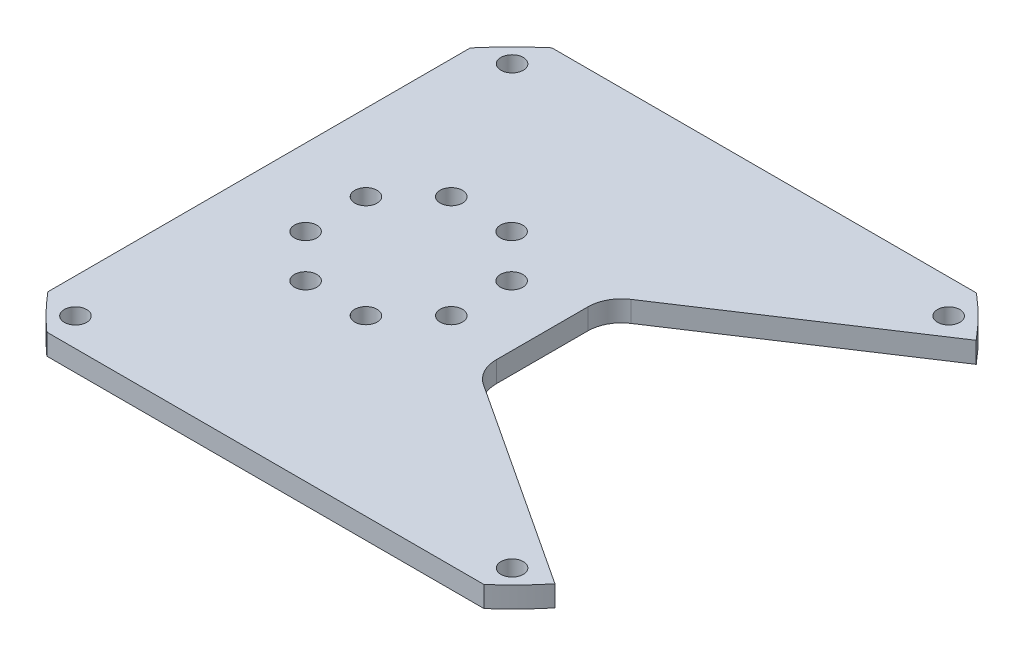
ISO-10303-21;
HEADER;
FILE_DESCRIPTION(('STEP AP214'),'2;1');
FILE_NAME('part.step','',(''),(''),'','','');
FILE_SCHEMA(('AUTOMOTIVE_DESIGN { 1 0 10303 214 1 1 1 1 }'));
ENDSEC;
DATA;
#1=APPLICATION_CONTEXT('core data for automotive mechanical design processes');
#2=APPLICATION_PROTOCOL_DEFINITION('international standard','automotive_design',2000,#1);
#3=PRODUCT_CONTEXT('',#1,'mechanical');
#4=PRODUCT('Part','Part','',(#3));
#5=PRODUCT_RELATED_PRODUCT_CATEGORY('part','',(#4));
#6=PRODUCT_DEFINITION_FORMATION('','',#4);
#7=PRODUCT_DEFINITION_CONTEXT('part definition',#1,'design');
#8=PRODUCT_DEFINITION('design','',#6,#7);
#9=PRODUCT_DEFINITION_SHAPE('','',#8);
#10=(LENGTH_UNIT() NAMED_UNIT(*) SI_UNIT(.MILLI.,.METRE.));
#11=(NAMED_UNIT(*) PLANE_ANGLE_UNIT() SI_UNIT($,.RADIAN.));
#12=(NAMED_UNIT(*) SI_UNIT($,.STERADIAN.) SOLID_ANGLE_UNIT());
#13=UNCERTAINTY_MEASURE_WITH_UNIT(LENGTH_MEASURE(1.E-05),#10,'distance_accuracy_value','');
#14=(GEOMETRIC_REPRESENTATION_CONTEXT(3) GLOBAL_UNCERTAINTY_ASSIGNED_CONTEXT((#13)) GLOBAL_UNIT_ASSIGNED_CONTEXT((#10,
#11,#12)) REPRESENTATION_CONTEXT('',''));
#15=CARTESIAN_POINT('',(0.,0.,0.));
#16=DIRECTION('',(0.,0.,1.));
#17=DIRECTION('',(1.,0.,0.));
#18=AXIS2_PLACEMENT_3D('',#15,#16,#17);
#19=CARTESIAN_POINT('',(0.,1.58750000000002,0.));
#20=DIRECTION('',(0.,1.,0.));
#21=DIRECTION('',(0.,0.,1.));
#22=AXIS2_PLACEMENT_3D('',#19,#20,#21);
#23=PLANE('',#22);
#24=CARTESIAN_POINT('',(-11.1557988116188,1.58750000000002,-11.0865543901354));
#25=DIRECTION('',(0.,-1.,0.));
#26=DIRECTION('',(0.,0.,-1.));
#27=AXIS2_PLACEMENT_3D('',#24,#25,#26);
#28=CIRCLE('',#27,1.7);
#29=CARTESIAN_POINT('',(-11.1557988116188,1.58750000000002,-12.7865543901354));
#30=VERTEX_POINT('',#29);
#31=EDGE_CURVE('E302',#30,#30,#28,.T.);
#32=ORIENTED_EDGE('',*,*,#31,.T.);
#33=EDGE_LOOP('',(#32));
#34=FACE_BOUND('',#33,.T.);
#35=CARTESIAN_POINT('',(-26.8345543901354,1.58750000000002,-4.59220118838111));
#36=DIRECTION('',(0.,-1.,0.));
#37=DIRECTION('',(0.,0.,-1.));
#38=AXIS2_PLACEMENT_3D('',#35,#36,#37);
#39=CIRCLE('',#38,1.7);
#40=CARTESIAN_POINT('',(-26.8345543901354,1.58750000000002,-6.29220118838111));
#41=VERTEX_POINT('',#40);
#42=EDGE_CURVE('E290',#41,#41,#39,.T.);
#43=ORIENTED_EDGE('',*,*,#42,.T.);
#44=EDGE_LOOP('',(#43));
#45=FACE_BOUND('',#44,.T.);
#46=CARTESIAN_POINT('',(0.,1.58750000000002,0.));
#47=DIRECTION('',(0.,1.,0.));
#48=DIRECTION('',(0.,0.,1.));
#49=AXIS2_PLACEMENT_3D('',#46,#47,#48);
#50=CIRCLE('',#49,50.165);
#51=CARTESIAN_POINT('',(-32.3185974565737,1.58749999999996,-38.3671146092582));
#52=VERTEX_POINT('',#51);
#53=CARTESIAN_POINT('',(-38.5094748897855,1.58749999999996,-32.1488346400455));
#54=VERTEX_POINT('',#53);
#55=EDGE_CURVE('E134',#52,#54,#50,.T.);
#56=ORIENTED_EDGE('',*,*,#55,.T.);
#57=DIRECTION('',(0.,0.,1.));
#58=VECTOR('',#57,1.);
#59=CARTESIAN_POINT('',(-38.5094748897855,1.58749999999996,-32.1488346400455));
#60=LINE('',#59,#58);
#61=CARTESIAN_POINT('',(-38.5094748897855,1.58749999999996,32.1488346400454));
#62=VERTEX_POINT('',#61);
#63=EDGE_CURVE('E123',#54,#62,#60,.T.);
#64=ORIENTED_EDGE('',*,*,#63,.T.);
#65=CARTESIAN_POINT('',(0.,1.58750000000002,0.));
#66=DIRECTION('',(0.,1.,0.));
#67=DIRECTION('',(0.,0.,-1.));
#68=AXIS2_PLACEMENT_3D('',#65,#66,#67);
#69=CIRCLE('',#68,50.165);
#70=CARTESIAN_POINT('',(-33.274,1.58749999999996,37.5415522987529));
#71=VERTEX_POINT('',#70);
#72=EDGE_CURVE('E133',#62,#71,#69,.T.);
#73=ORIENTED_EDGE('',*,*,#72,.T.);
#74=DIRECTION('',(1.,0.,0.));
#75=VECTOR('',#74,1.);
#76=CARTESIAN_POINT('',(-33.274,1.58749999999996,37.5415522987528));
#77=LINE('',#76,#75);
#78=CARTESIAN_POINT('',(33.274,1.58749999999996,37.5415522987529));
#79=VERTEX_POINT('',#78);
#80=EDGE_CURVE('E222',#71,#79,#77,.T.);
#81=ORIENTED_EDGE('',*,*,#80,.T.);
#82=CARTESIAN_POINT('',(0.,1.58750000000002,0.));
#83=DIRECTION('',(0.,1.,0.));
#84=DIRECTION('',(0.,0.,-1.));
#85=AXIS2_PLACEMENT_3D('',#82,#83,#84);
#86=CIRCLE('',#85,50.165);
#87=CARTESIAN_POINT('',(38.5872719681109,1.58749999999996,32.0554155652215));
#88=VERTEX_POINT('',#87);
#89=EDGE_CURVE('E239',#79,#88,#86,.T.);
#90=ORIENTED_EDGE('',*,*,#89,.T.);
#91=DIRECTION('',(-0.835913655809009,0.,-0.548860966030577));
#92=VECTOR('',#91,1.);
#93=CARTESIAN_POINT('',(4.57199999999997,1.58749999999996,9.72098556462353));
#94=LINE('',#93,#92);
#95=CARTESIAN_POINT('',(6.86378629256465,1.58749999999996,11.2257726077964));
#96=VERTEX_POINT('',#95);
#97=EDGE_CURVE('E237',#88,#96,#94,.T.);
#98=ORIENTED_EDGE('',*,*,#97,.T.);
#99=CARTESIAN_POINT('',(9.65199999999999,1.58750000000002,6.97933123628669));
#100=DIRECTION('',(0.,1.,0.));
#101=DIRECTION('',(0.,0.,1.));
#102=AXIS2_PLACEMENT_3D('',#99,#100,#101);
#103=CIRCLE('',#102,5.08);
#104=CARTESIAN_POINT('',(4.57199999999997,1.58749999999996,6.97933123628669));
#105=VERTEX_POINT('',#104);
#106=EDGE_CURVE('E11',#96,#105,#103,.F.);
#107=ORIENTED_EDGE('',*,*,#106,.T.);
#108=DIRECTION('',(0.,0.,-1.));
#109=VECTOR('',#108,1.);
#110=CARTESIAN_POINT('',(4.57199999999997,1.58749999999996,-9.72098556462359));
#111=LINE('',#110,#109);
#112=CARTESIAN_POINT('',(4.57199999999997,1.58749999999996,-6.9850777843139));
#113=VERTEX_POINT('',#112);
#114=EDGE_CURVE('E171',#105,#113,#111,.T.);
#115=ORIENTED_EDGE('',*,*,#114,.T.);
#116=CARTESIAN_POINT('',(9.65199999999994,1.58749999999996,-6.9850777843139));
#117=DIRECTION('',(0.,1.,0.));
#118=DIRECTION('',(0.,0.,1.));
#119=AXIS2_PLACEMENT_3D('',#116,#117,#118);
#120=CIRCLE('',#119,5.08);
#121=CARTESIAN_POINT('',(6.85634692626524,1.58749999999996,-11.2266251306626));
#122=VERTEX_POINT('',#121);
#123=EDGE_CURVE('E164',#113,#122,#120,.F.);
#124=ORIENTED_EDGE('',*,*,#123,.T.);
#125=DIRECTION('',(0.834950265029267,0.,-0.5503254082155));
#126=VECTOR('',#125,1.);
#127=CARTESIAN_POINT('',(4.57199999999997,1.58749999999996,-9.72098556462359));
#128=LINE('',#127,#126);
#129=CARTESIAN_POINT('',(38.5413694712101,1.58749999999996,-32.1105911543789));
#130=VERTEX_POINT('',#129);
#131=EDGE_CURVE('E168',#122,#130,#128,.T.);
#132=ORIENTED_EDGE('',*,*,#131,.T.);
#133=CARTESIAN_POINT('',(0.,1.58750000000002,0.));
#134=DIRECTION('',(0.,1.,0.));
#135=DIRECTION('',(0.,0.,1.));
#136=AXIS2_PLACEMENT_3D('',#133,#134,#135);
#137=CIRCLE('',#136,50.165);
#138=CARTESIAN_POINT('',(32.3185974565737,1.58749999999996,-38.3671146092582));
#139=VERTEX_POINT('',#138);
#140=EDGE_CURVE('E181',#130,#139,#137,.T.);
#141=ORIENTED_EDGE('',*,*,#140,.T.);
#142=DIRECTION('',(-1.,0.,0.));
#143=VECTOR('',#142,1.);
#144=CARTESIAN_POINT('',(-32.3185974565737,1.58749999999996,-38.3671146092582));
#145=LINE('',#144,#143);
#146=EDGE_CURVE('E139',#139,#52,#145,.T.);
#147=ORIENTED_EDGE('',*,*,#146,.T.);
#148=EDGE_LOOP('',(#56,#64,#73,#81,#90,#98,#107,#115,#124,#132,#141,#147));
#149=FACE_BOUND('',#148,.T.);
#150=CARTESIAN_POINT('',(-33.2269476479559,1.58749999999996,33.2269476479559));
#151=DIRECTION('',(0.,1.,0.));
#152=DIRECTION('',(0.,0.,1.));
#153=AXIS2_PLACEMENT_3D('',#150,#151,#152);
#154=CIRCLE('',#153,1.7);
#155=CARTESIAN_POINT('',(-33.2269476479559,1.58749999999996,34.9269476479559));
#156=VERTEX_POINT('',#155);
#157=EDGE_CURVE('E245',#156,#156,#154,.T.);
#158=ORIENTED_EDGE('',*,*,#157,.F.);
#159=EDGE_LOOP('',(#158));
#160=FACE_BOUND('',#159,.T.);
#161=CARTESIAN_POINT('',(33.2269476479558,1.58750000000002,33.2269476479558));
#162=DIRECTION('',(0.,1.,0.));
#163=DIRECTION('',(0.,0.,1.));
#164=AXIS2_PLACEMENT_3D('',#161,#162,#163);
#165=CIRCLE('',#164,1.7);
#166=CARTESIAN_POINT('',(33.2269476479558,1.58750000000002,34.9269476479558));
#167=VERTEX_POINT('',#166);
#168=EDGE_CURVE('E251',#167,#167,#165,.T.);
#169=ORIENTED_EDGE('',*,*,#168,.F.);
#170=EDGE_LOOP('',(#169));
#171=FACE_BOUND('',#170,.T.);
#172=CARTESIAN_POINT('',(33.2269476479559,1.58749999999996,-33.2269476479559));
#173=DIRECTION('',(0.,1.,0.));
#174=DIRECTION('',(0.,0.,1.));
#175=AXIS2_PLACEMENT_3D('',#172,#173,#174);
#176=CIRCLE('',#175,1.7);
#177=CARTESIAN_POINT('',(33.2269476479559,1.58749999999996,-31.5269476479559));
#178=VERTEX_POINT('',#177);
#179=EDGE_CURVE('E257',#178,#178,#176,.T.);
#180=ORIENTED_EDGE('',*,*,#179,.F.);
#181=EDGE_LOOP('',(#180));
#182=FACE_BOUND('',#181,.T.);
#183=CARTESIAN_POINT('',(-33.2269476479559,1.58750000000002,-33.2269476479559));
#184=DIRECTION('',(0.,1.,0.));
#185=DIRECTION('',(0.,0.,1.));
#186=AXIS2_PLACEMENT_3D('',#183,#184,#185);
#187=CIRCLE('',#186,1.7);
#188=CARTESIAN_POINT('',(-33.2269476479559,1.58750000000002,-31.5269476479559));
#189=VERTEX_POINT('',#188);
#190=EDGE_CURVE('E263',#189,#189,#187,.T.);
#191=ORIENTED_EDGE('',*,*,#190,.F.);
#192=EDGE_LOOP('',(#191));
#193=FACE_BOUND('',#192,.T.);
#194=CARTESIAN_POINT('',(-4.66144560986459,1.58749999999996,4.59220118838105));
#195=DIRECTION('',(0.,-1.,0.));
#196=DIRECTION('',(0.,0.,-1.));
#197=AXIS2_PLACEMENT_3D('',#194,#195,#196);
#198=CIRCLE('',#197,1.7);
#199=CARTESIAN_POINT('',(-4.66144560986459,1.58749999999996,2.89220118838105));
#200=VERTEX_POINT('',#199);
#201=EDGE_CURVE('E266',#200,#200,#198,.T.);
#202=ORIENTED_EDGE('',*,*,#201,.T.);
#203=EDGE_LOOP('',(#202));
#204=FACE_BOUND('',#203,.T.);
#205=CARTESIAN_POINT('',(-11.155798811619,1.58750000000002,11.0865543901355));
#206=DIRECTION('',(0.,-1.,0.));
#207=DIRECTION('',(0.,0.,-1.));
#208=AXIS2_PLACEMENT_3D('',#205,#206,#207);
#209=CIRCLE('',#208,1.7);
#210=CARTESIAN_POINT('',(-11.155798811619,1.58750000000002,9.38655439013545));
#211=VERTEX_POINT('',#210);
#212=EDGE_CURVE('E272',#211,#211,#209,.T.);
#213=ORIENTED_EDGE('',*,*,#212,.T.);
#214=EDGE_LOOP('',(#213));
#215=FACE_BOUND('',#214,.T.);
#216=CARTESIAN_POINT('',(-20.3402011883811,1.58749999999996,11.0865543901354));
#217=DIRECTION('',(0.,-1.,0.));
#218=DIRECTION('',(0.,0.,-1.));
#219=AXIS2_PLACEMENT_3D('',#216,#217,#218);
#220=CIRCLE('',#219,1.7);
#221=CARTESIAN_POINT('',(-20.3402011883811,1.58749999999996,9.38655439013539));
#222=VERTEX_POINT('',#221);
#223=EDGE_CURVE('E278',#222,#222,#220,.T.);
#224=ORIENTED_EDGE('',*,*,#223,.T.);
#225=EDGE_LOOP('',(#224));
#226=FACE_BOUND('',#225,.T.);
#227=CARTESIAN_POINT('',(-26.8345543901355,1.58749999999996,4.592201188381));
#228=DIRECTION('',(0.,-1.,0.));
#229=DIRECTION('',(0.,0.,-1.));
#230=AXIS2_PLACEMENT_3D('',#227,#228,#229);
#231=CIRCLE('',#230,1.7);
#232=CARTESIAN_POINT('',(-26.8345543901355,1.58749999999996,2.89220118838099));
#233=VERTEX_POINT('',#232);
#234=EDGE_CURVE('E284',#233,#233,#231,.T.);
#235=ORIENTED_EDGE('',*,*,#234,.T.);
#236=EDGE_LOOP('',(#235));
#237=FACE_BOUND('',#236,.T.);
#238=CARTESIAN_POINT('',(-20.340201188381,1.58749999999996,-11.0865543901355));
#239=DIRECTION('',(0.,-1.,0.));
#240=DIRECTION('',(0.,0.,-1.));
#241=AXIS2_PLACEMENT_3D('',#238,#239,#240);
#242=CIRCLE('',#241,1.7);
#243=CARTESIAN_POINT('',(-20.340201188381,1.58749999999996,-12.7865543901355));
#244=VERTEX_POINT('',#243);
#245=EDGE_CURVE('E296',#244,#244,#242,.T.);
#246=ORIENTED_EDGE('',*,*,#245,.T.);
#247=EDGE_LOOP('',(#246));
#248=FACE_BOUND('',#247,.T.);
#249=CARTESIAN_POINT('',(-4.66144560986451,1.58750000000002,-4.59220118838094));
#250=DIRECTION('',(0.,-1.,0.));
#251=DIRECTION('',(0.,0.,-1.));
#252=AXIS2_PLACEMENT_3D('',#249,#250,#251);
#253=CIRCLE('',#252,1.7);
#254=CARTESIAN_POINT('',(-4.66144560986451,1.58750000000002,-6.29220118838094));
#255=VERTEX_POINT('',#254);
#256=EDGE_CURVE('E308',#255,#255,#253,.T.);
#257=ORIENTED_EDGE('',*,*,#256,.T.);
#258=EDGE_LOOP('',(#257));
#259=FACE_BOUND('',#258,.T.);
#260=ADVANCED_FACE('F34',(#34,#45,#149,#160,#171,#182,#193,#204,#215,#226,#237,#248,#259),#23,.T.);
#261=CARTESIAN_POINT('',(0.,-1.58750000000002,0.));
#262=DIRECTION('',(0.,1.,0.));
#263=DIRECTION('',(0.,0.,1.));
#264=AXIS2_PLACEMENT_3D('',#261,#262,#263);
#265=PLANE('',#264);
#266=CARTESIAN_POINT('',(-20.340201188381,-1.58750000000002,-11.0865543901355));
#267=DIRECTION('',(0.,-1.,0.));
#268=DIRECTION('',(0.,0.,-1.));
#269=AXIS2_PLACEMENT_3D('',#266,#267,#268);
#270=CIRCLE('',#269,1.69999999999999);
#271=CARTESIAN_POINT('',(-20.340201188381,-1.58750000000002,-12.7865543901355));
#272=VERTEX_POINT('',#271);
#273=EDGE_CURVE('E299',#272,#272,#270,.T.);
#274=ORIENTED_EDGE('',*,*,#273,.F.);
#275=EDGE_LOOP('',(#274));
#276=FACE_BOUND('',#275,.T.);
#277=CARTESIAN_POINT('',(-26.8345543901354,-1.58750000000002,-4.59220118838111));
#278=DIRECTION('',(0.,-1.,0.));
#279=DIRECTION('',(0.,0.,-1.));
#280=AXIS2_PLACEMENT_3D('',#277,#278,#279);
#281=CIRCLE('',#280,1.69999999999999);
#282=CARTESIAN_POINT('',(-26.8345543901354,-1.58750000000002,-6.29220118838109));
#283=VERTEX_POINT('',#282);
#284=EDGE_CURVE('E293',#283,#283,#281,.T.);
#285=ORIENTED_EDGE('',*,*,#284,.F.);
#286=EDGE_LOOP('',(#285));
#287=FACE_BOUND('',#286,.T.);
#288=CARTESIAN_POINT('',(-11.155798811619,-1.58750000000002,11.0865543901355));
#289=DIRECTION('',(0.,-1.,0.));
#290=DIRECTION('',(0.,0.,-1.));
#291=AXIS2_PLACEMENT_3D('',#288,#289,#290);
#292=CIRCLE('',#291,1.69999999999999);
#293=CARTESIAN_POINT('',(-11.155798811619,-1.58750000000002,9.38655439013546));
#294=VERTEX_POINT('',#293);
#295=EDGE_CURVE('E275',#294,#294,#292,.T.);
#296=ORIENTED_EDGE('',*,*,#295,.F.);
#297=EDGE_LOOP('',(#296));
#298=FACE_BOUND('',#297,.T.);
#299=CARTESIAN_POINT('',(-4.66144560986459,-1.58750000000002,4.592201188381));
#300=DIRECTION('',(0.,-1.,0.));
#301=DIRECTION('',(0.,0.,-1.));
#302=AXIS2_PLACEMENT_3D('',#299,#300,#301);
#303=CIRCLE('',#302,1.69999999999999);
#304=CARTESIAN_POINT('',(-4.66144560986459,-1.58750000000002,2.89220118838101));
#305=VERTEX_POINT('',#304);
#306=EDGE_CURVE('E269',#305,#305,#303,.T.);
#307=ORIENTED_EDGE('',*,*,#306,.F.);
#308=EDGE_LOOP('',(#307));
#309=FACE_BOUND('',#308,.T.);
#310=CARTESIAN_POINT('',(-33.2269476479559,-1.58750000000002,-33.2269476479559));
#311=DIRECTION('',(0.,1.,0.));
#312=DIRECTION('',(0.,0.,1.));
#313=AXIS2_PLACEMENT_3D('',#310,#311,#312);
#314=CIRCLE('',#313,1.7);
#315=CARTESIAN_POINT('',(-33.2269476479559,-1.58750000000002,-31.5269476479559));
#316=VERTEX_POINT('',#315);
#317=EDGE_CURVE('E260',#316,#316,#314,.T.);
#318=ORIENTED_EDGE('',*,*,#317,.T.);
#319=EDGE_LOOP('',(#318));
#320=FACE_BOUND('',#319,.T.);
#321=CARTESIAN_POINT('',(33.2269476479558,-1.58750000000002,-33.2269476479559));
#322=DIRECTION('',(0.,1.,0.));
#323=DIRECTION('',(0.,0.,1.));
#324=AXIS2_PLACEMENT_3D('',#321,#322,#323);
#325=CIRCLE('',#324,1.7);
#326=CARTESIAN_POINT('',(33.2269476479558,-1.58750000000002,-31.5269476479559));
#327=VERTEX_POINT('',#326);
#328=EDGE_CURVE('E254',#327,#327,#325,.T.);
#329=ORIENTED_EDGE('',*,*,#328,.T.);
#330=EDGE_LOOP('',(#329));
#331=FACE_BOUND('',#330,.T.);
#332=CARTESIAN_POINT('',(33.2269476479559,-1.58750000000002,33.2269476479558));
#333=DIRECTION('',(0.,1.,0.));
#334=DIRECTION('',(0.,0.,1.));
#335=AXIS2_PLACEMENT_3D('',#332,#333,#334);
#336=CIRCLE('',#335,1.7);
#337=CARTESIAN_POINT('',(33.2269476479559,-1.58750000000002,34.9269476479558));
#338=VERTEX_POINT('',#337);
#339=EDGE_CURVE('E248',#338,#338,#336,.T.);
#340=ORIENTED_EDGE('',*,*,#339,.T.);
#341=EDGE_LOOP('',(#340));
#342=FACE_BOUND('',#341,.T.);
#343=CARTESIAN_POINT('',(-33.2269476479559,-1.58750000000002,33.2269476479559));
#344=DIRECTION('',(0.,1.,0.));
#345=DIRECTION('',(0.,0.,1.));
#346=AXIS2_PLACEMENT_3D('',#343,#344,#345);
#347=CIRCLE('',#346,1.7);
#348=CARTESIAN_POINT('',(-33.2269476479559,-1.58750000000002,34.9269476479559));
#349=VERTEX_POINT('',#348);
#350=EDGE_CURVE('E233',#349,#349,#347,.T.);
#351=ORIENTED_EDGE('',*,*,#350,.T.);
#352=EDGE_LOOP('',(#351));
#353=FACE_BOUND('',#352,.T.);
#354=CARTESIAN_POINT('',(0.,-1.58750000000002,0.));
#355=DIRECTION('',(0.,1.,0.));
#356=DIRECTION('',(0.,0.,1.));
#357=AXIS2_PLACEMENT_3D('',#354,#355,#356);
#358=CIRCLE('',#357,50.165);
#359=CARTESIAN_POINT('',(-32.3185974565737,-1.58750000000002,-38.3671146092582));
#360=VERTEX_POINT('',#359);
#361=CARTESIAN_POINT('',(-38.5094748897855,-1.58750000000002,-32.1488346400455));
#362=VERTEX_POINT('',#361);
#363=EDGE_CURVE('E147',#360,#362,#358,.T.);
#364=ORIENTED_EDGE('',*,*,#363,.F.);
#365=DIRECTION('',(-1.,0.,0.));
#366=VECTOR('',#365,1.);
#367=CARTESIAN_POINT('',(-32.3185974565737,-1.58750000000002,-38.3671146092582));
#368=LINE('',#367,#366);
#369=CARTESIAN_POINT('',(32.3185974565737,-1.58750000000002,-38.3671146092582));
#370=VERTEX_POINT('',#369);
#371=EDGE_CURVE('E143',#370,#360,#368,.T.);
#372=ORIENTED_EDGE('',*,*,#371,.F.);
#373=CARTESIAN_POINT('',(0.,-1.58750000000002,0.));
#374=DIRECTION('',(0.,1.,0.));
#375=DIRECTION('',(0.,0.,1.));
#376=AXIS2_PLACEMENT_3D('',#373,#374,#375);
#377=CIRCLE('',#376,50.165);
#378=CARTESIAN_POINT('',(38.5413694712101,-1.58750000000002,-32.1105911543789));
#379=VERTEX_POINT('',#378);
#380=EDGE_CURVE('E195',#379,#370,#377,.T.);
#381=ORIENTED_EDGE('',*,*,#380,.F.);
#382=DIRECTION('',(0.834950265029267,0.,-0.5503254082155));
#383=VECTOR('',#382,1.);
#384=CARTESIAN_POINT('',(4.57199999999999,-1.58750000000002,-9.72098556462364));
#385=LINE('',#384,#383);
#386=CARTESIAN_POINT('',(6.85634692626524,-1.58750000000007,-11.2266251306626));
#387=VERTEX_POINT('',#386);
#388=EDGE_CURVE('E189',#387,#379,#385,.T.);
#389=ORIENTED_EDGE('',*,*,#388,.F.);
#390=CARTESIAN_POINT('',(9.65199999999997,-1.58750000000002,-6.9850777843139));
#391=DIRECTION('',(0.,1.,0.));
#392=DIRECTION('',(0.,0.,1.));
#393=AXIS2_PLACEMENT_3D('',#390,#391,#392);
#394=CIRCLE('',#393,5.08);
#395=CARTESIAN_POINT('',(4.57199999999999,-1.58750000000002,-6.9850777843139));
#396=VERTEX_POINT('',#395);
#397=EDGE_CURVE('E162',#387,#396,#394,.T.);
#398=ORIENTED_EDGE('',*,*,#397,.T.);
#399=DIRECTION('',(0.,0.,-1.));
#400=VECTOR('',#399,1.);
#401=CARTESIAN_POINT('',(4.57199999999999,-1.58750000000002,-9.72098556462364));
#402=LINE('',#401,#400);
#403=CARTESIAN_POINT('',(4.57199999999997,-1.58750000000007,6.97933123628669));
#404=VERTEX_POINT('',#403);
#405=EDGE_CURVE('E187',#404,#396,#402,.T.);
#406=ORIENTED_EDGE('',*,*,#405,.F.);
#407=CARTESIAN_POINT('',(9.65199999999999,-1.58750000000002,6.97933123628663));
#408=DIRECTION('',(0.,1.,0.));
#409=DIRECTION('',(0.,0.,1.));
#410=AXIS2_PLACEMENT_3D('',#407,#408,#409);
#411=CIRCLE('',#410,5.08);
#412=CARTESIAN_POINT('',(6.86378629256462,-1.58750000000002,11.2257726077964));
#413=VERTEX_POINT('',#412);
#414=EDGE_CURVE('E42',#404,#413,#411,.T.);
#415=ORIENTED_EDGE('',*,*,#414,.T.);
#416=DIRECTION('',(-0.835913655809009,0.,-0.548860966030577));
#417=VECTOR('',#416,1.);
#418=CARTESIAN_POINT('',(4.57199999999999,-1.58750000000002,9.72098556462359));
#419=LINE('',#418,#417);
#420=CARTESIAN_POINT('',(38.5872719681108,-1.58750000000002,32.0554155652214));
#421=VERTEX_POINT('',#420);
#422=EDGE_CURVE('E193',#421,#413,#419,.T.);
#423=ORIENTED_EDGE('',*,*,#422,.F.);
#424=CARTESIAN_POINT('',(0.,-1.58750000000002,0.));
#425=DIRECTION('',(0.,1.,0.));
#426=DIRECTION('',(0.,0.,-1.));
#427=AXIS2_PLACEMENT_3D('',#424,#425,#426);
#428=CIRCLE('',#427,50.165);
#429=CARTESIAN_POINT('',(33.274,-1.58750000000002,37.5415522987529));
#430=VERTEX_POINT('',#429);
#431=EDGE_CURVE('E197',#430,#421,#428,.T.);
#432=ORIENTED_EDGE('',*,*,#431,.F.);
#433=DIRECTION('',(1.,0.,0.));
#434=VECTOR('',#433,1.);
#435=CARTESIAN_POINT('',(-33.274,-1.58750000000002,37.5415522987529));
#436=LINE('',#435,#434);
#437=CARTESIAN_POINT('',(-33.274,-1.58750000000002,37.5415522987529));
#438=VERTEX_POINT('',#437);
#439=EDGE_CURVE('E221',#438,#430,#436,.T.);
#440=ORIENTED_EDGE('',*,*,#439,.F.);
#441=CARTESIAN_POINT('',(0.,-1.58750000000002,0.));
#442=DIRECTION('',(0.,1.,0.));
#443=DIRECTION('',(0.,0.,-1.));
#444=AXIS2_PLACEMENT_3D('',#441,#442,#443);
#445=CIRCLE('',#444,50.165);
#446=CARTESIAN_POINT('',(-38.5094748897855,-1.58750000000002,32.1488346400454));
#447=VERTEX_POINT('',#446);
#448=EDGE_CURVE('E226',#447,#438,#445,.T.);
#449=ORIENTED_EDGE('',*,*,#448,.F.);
#450=DIRECTION('',(0.,0.,1.));
#451=VECTOR('',#450,1.);
#452=CARTESIAN_POINT('',(-38.5094748897855,-1.58750000000002,-32.1488346400455));
#453=LINE('',#452,#451);
#454=EDGE_CURVE('E228',#362,#447,#453,.T.);
#455=ORIENTED_EDGE('',*,*,#454,.F.);
#456=EDGE_LOOP('',(#364,#372,#381,#389,#398,#406,#415,#423,#432,#440,#449,#455));
#457=FACE_BOUND('',#456,.T.);
#458=CARTESIAN_POINT('',(-20.3402011883811,-1.58750000000002,11.0865543901354));
#459=DIRECTION('',(0.,-1.,0.));
#460=DIRECTION('',(0.,0.,-1.));
#461=AXIS2_PLACEMENT_3D('',#458,#459,#460);
#462=CIRCLE('',#461,1.69999999999999);
#463=CARTESIAN_POINT('',(-20.3402011883811,-1.58750000000002,9.38655439013541));
#464=VERTEX_POINT('',#463);
#465=EDGE_CURVE('E281',#464,#464,#462,.T.);
#466=ORIENTED_EDGE('',*,*,#465,.F.);
#467=EDGE_LOOP('',(#466));
#468=FACE_BOUND('',#467,.T.);
#469=CARTESIAN_POINT('',(-26.8345543901355,-1.58750000000002,4.592201188381));
#470=DIRECTION('',(0.,-1.,0.));
#471=DIRECTION('',(0.,0.,-1.));
#472=AXIS2_PLACEMENT_3D('',#469,#470,#471);
#473=CIRCLE('',#472,1.69999999999999);
#474=CARTESIAN_POINT('',(-26.8345543901355,-1.58750000000002,2.89220118838101));
#475=VERTEX_POINT('',#474);
#476=EDGE_CURVE('E287',#475,#475,#473,.T.);
#477=ORIENTED_EDGE('',*,*,#476,.F.);
#478=EDGE_LOOP('',(#477));
#479=FACE_BOUND('',#478,.T.);
#480=CARTESIAN_POINT('',(-11.1557988116188,-1.58750000000002,-11.0865543901354));
#481=DIRECTION('',(0.,-1.,0.));
#482=DIRECTION('',(0.,0.,-1.));
#483=AXIS2_PLACEMENT_3D('',#480,#481,#482);
#484=CIRCLE('',#483,1.69999999999999);
#485=CARTESIAN_POINT('',(-11.1557988116188,-1.58750000000002,-12.7865543901354));
#486=VERTEX_POINT('',#485);
#487=EDGE_CURVE('E305',#486,#486,#484,.T.);
#488=ORIENTED_EDGE('',*,*,#487,.F.);
#489=EDGE_LOOP('',(#488));
#490=FACE_BOUND('',#489,.T.);
#491=CARTESIAN_POINT('',(-4.66144560986448,-1.58750000000002,-4.59220118838094));
#492=DIRECTION('',(0.,-1.,0.));
#493=DIRECTION('',(0.,0.,-1.));
#494=AXIS2_PLACEMENT_3D('',#491,#492,#493);
#495=CIRCLE('',#494,1.69999999999999);
#496=CARTESIAN_POINT('',(-4.66144560986448,-1.58750000000002,-6.29220118838093));
#497=VERTEX_POINT('',#496);
#498=EDGE_CURVE('E311',#497,#497,#495,.T.);
#499=ORIENTED_EDGE('',*,*,#498,.F.);
#500=EDGE_LOOP('',(#499));
#501=FACE_BOUND('',#500,.T.);
#502=ADVANCED_FACE('F185',(#276,#287,#298,#309,#320,#331,#342,#353,#457,#468,#479,#490,#501),
#265,.F.);
#503=CARTESIAN_POINT('',(0.,1.58750000000002,0.));
#504=DIRECTION('',(0.,-1.,0.));
#505=DIRECTION('',(0.,0.,-1.));
#506=AXIS2_PLACEMENT_3D('',#503,#504,#505);
#507=CYLINDRICAL_SURFACE('',#506,50.165);
#508=ORIENTED_EDGE('',*,*,#363,.T.);
#509=DIRECTION('',(0.,-1.,0.));
#510=VECTOR('',#509,1.);
#511=CARTESIAN_POINT('',(-38.5094748897855,1.58749999999996,-32.1488346400455));
#512=LINE('',#511,#510);
#513=EDGE_CURVE('E127',#54,#362,#512,.T.);
#514=ORIENTED_EDGE('',*,*,#513,.F.);
#515=ORIENTED_EDGE('',*,*,#55,.F.);
#516=DIRECTION('',(0.,-1.,0.));
#517=VECTOR('',#516,1.);
#518=CARTESIAN_POINT('',(-32.3185974565737,1.58749999999996,-38.3671146092582));
#519=LINE('',#518,#517);
#520=EDGE_CURVE('E203',#52,#360,#519,.T.);
#521=ORIENTED_EDGE('',*,*,#520,.T.);
#522=EDGE_LOOP('',(#508,#514,#515,#521));
#523=FACE_BOUND('',#522,.T.);
#524=ADVANCED_FACE('F145',(#523),#507,.T.);
#525=CARTESIAN_POINT('',(-38.5094748897855,1.58749999999996,-32.1488346400455));
#526=DIRECTION('',(1.,0.,0.));
#527=DIRECTION('',(0.,0.,-1.));
#528=AXIS2_PLACEMENT_3D('',#525,#526,#527);
#529=PLANE('',#528);
#530=ORIENTED_EDGE('',*,*,#454,.T.);
#531=DIRECTION('',(0.,-1.,0.));
#532=VECTOR('',#531,1.);
#533=CARTESIAN_POINT('',(-38.5094748897855,1.58749999999996,32.1488346400454));
#534=LINE('',#533,#532);
#535=EDGE_CURVE('E130',#62,#447,#534,.T.);
#536=ORIENTED_EDGE('',*,*,#535,.F.);
#537=ORIENTED_EDGE('',*,*,#63,.F.);
#538=ORIENTED_EDGE('',*,*,#513,.T.);
#539=EDGE_LOOP('',(#530,#536,#537,#538));
#540=FACE_BOUND('',#539,.T.);
#541=ADVANCED_FACE('F125',(#540),#529,.F.);
#542=CARTESIAN_POINT('',(0.,1.58750000000002,0.));
#543=DIRECTION('',(0.,-1.,0.));
#544=DIRECTION('',(0.,0.,-1.));
#545=AXIS2_PLACEMENT_3D('',#542,#543,#544);
#546=CYLINDRICAL_SURFACE('',#545,50.165);
#547=ORIENTED_EDGE('',*,*,#448,.T.);
#548=DIRECTION('',(0.,-1.,0.));
#549=VECTOR('',#548,1.);
#550=CARTESIAN_POINT('',(-33.274,1.58749999999996,37.5415522987529));
#551=LINE('',#550,#549);
#552=EDGE_CURVE('E153',#71,#438,#551,.T.);
#553=ORIENTED_EDGE('',*,*,#552,.F.);
#554=ORIENTED_EDGE('',*,*,#72,.F.);
#555=ORIENTED_EDGE('',*,*,#535,.T.);
#556=EDGE_LOOP('',(#547,#553,#554,#555));
#557=FACE_BOUND('',#556,.T.);
#558=ADVANCED_FACE('F353',(#557),#546,.T.);
#559=CARTESIAN_POINT('',(-33.274,1.58749999999996,37.5415522987528));
#560=DIRECTION('',(0.,0.,-1.));
#561=DIRECTION('',(-1.,0.,0.));
#562=AXIS2_PLACEMENT_3D('',#559,#560,#561);
#563=PLANE('',#562);
#564=ORIENTED_EDGE('',*,*,#439,.T.);
#565=DIRECTION('',(0.,-1.,0.));
#566=VECTOR('',#565,1.);
#567=CARTESIAN_POINT('',(33.274,1.58749999999996,37.5415522987529));
#568=LINE('',#567,#566);
#569=EDGE_CURVE('E212',#79,#430,#568,.T.);
#570=ORIENTED_EDGE('',*,*,#569,.F.);
#571=ORIENTED_EDGE('',*,*,#80,.F.);
#572=ORIENTED_EDGE('',*,*,#552,.T.);
#573=EDGE_LOOP('',(#564,#570,#571,#572));
#574=FACE_BOUND('',#573,.T.);
#575=ADVANCED_FACE('F219',(#574),#563,.F.);
#576=CARTESIAN_POINT('',(0.,1.58750000000002,0.));
#577=DIRECTION('',(0.,-1.,0.));
#578=DIRECTION('',(0.,0.,-1.));
#579=AXIS2_PLACEMENT_3D('',#576,#577,#578);
#580=CYLINDRICAL_SURFACE('',#579,50.165);
#581=ORIENTED_EDGE('',*,*,#431,.T.);
#582=DIRECTION('',(0.,-1.,0.));
#583=VECTOR('',#582,1.);
#584=CARTESIAN_POINT('',(38.5872719681109,1.58749999999996,32.0554155652215));
#585=LINE('',#584,#583);
#586=EDGE_CURVE('E209',#88,#421,#585,.T.);
#587=ORIENTED_EDGE('',*,*,#586,.F.);
#588=ORIENTED_EDGE('',*,*,#89,.F.);
#589=ORIENTED_EDGE('',*,*,#569,.T.);
#590=EDGE_LOOP('',(#581,#587,#588,#589));
#591=FACE_BOUND('',#590,.T.);
#592=ADVANCED_FACE('F347',(#591),#580,.T.);
#593=CARTESIAN_POINT('',(4.57199999999997,1.58749999999996,9.72098556462353));
#594=DIRECTION('',(-0.548860966030577,0.,0.835913655809009));
#595=DIRECTION('',(0.835913655809009,0.,0.548860966030577));
#596=AXIS2_PLACEMENT_3D('',#593,#594,#595);
#597=PLANE('',#596);
#598=ORIENTED_EDGE('',*,*,#422,.T.);
#599=DIRECTION('',(0.,-1.,0.));
#600=VECTOR('',#599,1.);
#601=CARTESIAN_POINT('',(6.86378629256465,1.58749999999996,11.2257726077964));
#602=LINE('',#601,#600);
#603=EDGE_CURVE('E49',#413,#96,#602,.F.);
#604=ORIENTED_EDGE('',*,*,#603,.T.);
#605=ORIENTED_EDGE('',*,*,#97,.F.);
#606=ORIENTED_EDGE('',*,*,#586,.T.);
#607=EDGE_LOOP('',(#598,#604,#605,#606));
#608=FACE_BOUND('',#607,.T.);
#609=ADVANCED_FACE('F344',(#608),#597,.F.);
#610=CARTESIAN_POINT('',(4.57199999999997,1.58749999999996,-9.72098556462359));
#611=DIRECTION('',(-1.,0.,0.));
#612=DIRECTION('',(0.,0.,1.));
#613=AXIS2_PLACEMENT_3D('',#610,#611,#612);
#614=PLANE('',#613);
#615=ORIENTED_EDGE('',*,*,#405,.T.);
#616=DIRECTION('',(0.,-1.,0.));
#617=VECTOR('',#616,1.);
#618=CARTESIAN_POINT('',(4.57199999999997,1.58749999999996,-6.9850777843139));
#619=LINE('',#618,#617);
#620=EDGE_CURVE('E159',#396,#113,#619,.F.);
#621=ORIENTED_EDGE('',*,*,#620,.T.);
#622=ORIENTED_EDGE('',*,*,#114,.F.);
#623=DIRECTION('',(0.,-1.,0.));
#624=VECTOR('',#623,1.);
#625=CARTESIAN_POINT('',(4.57199999999997,-1.58750000000007,6.97933123628669));
#626=LINE('',#625,#624);
#627=EDGE_CURVE('E151',#105,#404,#626,.T.);
#628=ORIENTED_EDGE('',*,*,#627,.T.);
#629=EDGE_LOOP('',(#615,#621,#622,#628));
#630=FACE_BOUND('',#629,.T.);
#631=ADVANCED_FACE('F191',(#630),#614,.F.);
#632=CARTESIAN_POINT('',(4.57199999999997,1.58749999999996,-9.72098556462359));
#633=DIRECTION('',(-0.5503254082155,0.,-0.834950265029267));
#634=DIRECTION('',(-0.834950265029267,0.,0.5503254082155));
#635=AXIS2_PLACEMENT_3D('',#632,#633,#634);
#636=PLANE('',#635);
#637=ORIENTED_EDGE('',*,*,#131,.F.);
#638=DIRECTION('',(0.,-1.,0.));
#639=VECTOR('',#638,1.);
#640=CARTESIAN_POINT('',(6.85634692626524,-1.58750000000007,-11.2266251306626));
#641=LINE('',#640,#639);
#642=EDGE_CURVE('E148',#122,#387,#641,.T.);
#643=ORIENTED_EDGE('',*,*,#642,.T.);
#644=ORIENTED_EDGE('',*,*,#388,.T.);
#645=DIRECTION('',(0.,-1.,0.));
#646=VECTOR('',#645,1.);
#647=CARTESIAN_POINT('',(38.5413694712101,1.58749999999996,-32.1105911543789));
#648=LINE('',#647,#646);
#649=EDGE_CURVE('E179',#130,#379,#648,.T.);
#650=ORIENTED_EDGE('',*,*,#649,.F.);
#651=EDGE_LOOP('',(#637,#643,#644,#650));
#652=FACE_BOUND('',#651,.T.);
#653=ADVANCED_FACE('F176',(#652),#636,.F.);
#654=CARTESIAN_POINT('',(0.,1.58750000000002,0.));
#655=DIRECTION('',(0.,-1.,0.));
#656=DIRECTION('',(0.,0.,-1.));
#657=AXIS2_PLACEMENT_3D('',#654,#655,#656);
#658=CYLINDRICAL_SURFACE('',#657,50.165);
#659=ORIENTED_EDGE('',*,*,#380,.T.);
#660=DIRECTION('',(0.,-1.,0.));
#661=VECTOR('',#660,1.);
#662=CARTESIAN_POINT('',(32.3185974565737,1.58749999999996,-38.3671146092582));
#663=LINE('',#662,#661);
#664=EDGE_CURVE('E205',#139,#370,#663,.T.);
#665=ORIENTED_EDGE('',*,*,#664,.F.);
#666=ORIENTED_EDGE('',*,*,#140,.F.);
#667=ORIENTED_EDGE('',*,*,#649,.T.);
#668=EDGE_LOOP('',(#659,#665,#666,#667));
#669=FACE_BOUND('',#668,.T.);
#670=ADVANCED_FACE('F335',(#669),#658,.T.);
#671=CARTESIAN_POINT('',(-32.3185974565737,1.58749999999996,-38.3671146092582));
#672=DIRECTION('',(0.,0.,1.));
#673=DIRECTION('',(1.,0.,0.));
#674=AXIS2_PLACEMENT_3D('',#671,#672,#673);
#675=PLANE('',#674);
#676=ORIENTED_EDGE('',*,*,#371,.T.);
#677=ORIENTED_EDGE('',*,*,#520,.F.);
#678=ORIENTED_EDGE('',*,*,#146,.F.);
#679=ORIENTED_EDGE('',*,*,#664,.T.);
#680=EDGE_LOOP('',(#676,#677,#678,#679));
#681=FACE_BOUND('',#680,.T.);
#682=ADVANCED_FACE('F331',(#681),#675,.F.);
#683=CARTESIAN_POINT('',(-33.2269476479559,1.58749999999996,33.2269476479559));
#684=DIRECTION('',(0.,1.,0.));
#685=DIRECTION('',(0.,0.,1.));
#686=AXIS2_PLACEMENT_3D('',#683,#684,#685);
#687=CYLINDRICAL_SURFACE('',#686,1.7);
#688=ORIENTED_EDGE('',*,*,#350,.F.);
#689=EDGE_LOOP('',(#688));
#690=FACE_BOUND('',#689,.T.);
#691=ORIENTED_EDGE('',*,*,#157,.T.);
#692=EDGE_LOOP('',(#691));
#693=FACE_BOUND('',#692,.T.);
#694=ADVANCED_FACE('F334',(#690,#693),#687,.F.);
#695=CARTESIAN_POINT('',(33.2269476479558,1.58750000000002,33.2269476479558));
#696=DIRECTION('',(0.,1.,0.));
#697=DIRECTION('',(0.,0.,1.));
#698=AXIS2_PLACEMENT_3D('',#695,#696,#697);
#699=CYLINDRICAL_SURFACE('',#698,1.7);
#700=ORIENTED_EDGE('',*,*,#339,.F.);
#701=EDGE_LOOP('',(#700));
#702=FACE_BOUND('',#701,.T.);
#703=ORIENTED_EDGE('',*,*,#168,.T.);
#704=EDGE_LOOP('',(#703));
#705=FACE_BOUND('',#704,.T.);
#706=ADVANCED_FACE('F404',(#702,#705),#699,.F.);
#707=CARTESIAN_POINT('',(33.2269476479559,1.58749999999996,-33.2269476479559));
#708=DIRECTION('',(0.,1.,0.));
#709=DIRECTION('',(0.,0.,1.));
#710=AXIS2_PLACEMENT_3D('',#707,#708,#709);
#711=CYLINDRICAL_SURFACE('',#710,1.7);
#712=ORIENTED_EDGE('',*,*,#328,.F.);
#713=EDGE_LOOP('',(#712));
#714=FACE_BOUND('',#713,.T.);
#715=ORIENTED_EDGE('',*,*,#179,.T.);
#716=EDGE_LOOP('',(#715));
#717=FACE_BOUND('',#716,.T.);
#718=ADVANCED_FACE('F400',(#714,#717),#711,.F.);
#719=CARTESIAN_POINT('',(-33.2269476479559,1.58750000000002,-33.2269476479559));
#720=DIRECTION('',(0.,1.,0.));
#721=DIRECTION('',(0.,0.,1.));
#722=AXIS2_PLACEMENT_3D('',#719,#720,#721);
#723=CYLINDRICAL_SURFACE('',#722,1.7);
#724=ORIENTED_EDGE('',*,*,#317,.F.);
#725=EDGE_LOOP('',(#724));
#726=FACE_BOUND('',#725,.T.);
#727=ORIENTED_EDGE('',*,*,#190,.T.);
#728=EDGE_LOOP('',(#727));
#729=FACE_BOUND('',#728,.T.);
#730=ADVANCED_FACE('F396',(#726,#729),#723,.F.);
#731=CARTESIAN_POINT('',(-4.66144560986459,-1.58750000000002,4.592201188381));
#732=DIRECTION('',(0.,-1.,0.));
#733=DIRECTION('',(0.,0.,-1.));
#734=AXIS2_PLACEMENT_3D('',#731,#732,#733);
#735=CYLINDRICAL_SURFACE('',#734,1.69999999999999);
#736=ORIENTED_EDGE('',*,*,#201,.F.);
#737=EDGE_LOOP('',(#736));
#738=FACE_BOUND('',#737,.T.);
#739=ORIENTED_EDGE('',*,*,#306,.T.);
#740=EDGE_LOOP('',(#739));
#741=FACE_BOUND('',#740,.T.);
#742=ADVANCED_FACE('F392',(#738,#741),#735,.F.);
#743=CARTESIAN_POINT('',(-11.155798811619,-1.58750000000002,11.0865543901355));
#744=DIRECTION('',(0.,-1.,0.));
#745=DIRECTION('',(0.,0.,-1.));
#746=AXIS2_PLACEMENT_3D('',#743,#744,#745);
#747=CYLINDRICAL_SURFACE('',#746,1.69999999999999);
#748=ORIENTED_EDGE('',*,*,#212,.F.);
#749=EDGE_LOOP('',(#748));
#750=FACE_BOUND('',#749,.T.);
#751=ORIENTED_EDGE('',*,*,#295,.T.);
#752=EDGE_LOOP('',(#751));
#753=FACE_BOUND('',#752,.T.);
#754=ADVANCED_FACE('F388',(#750,#753),#747,.F.);
#755=CARTESIAN_POINT('',(-20.3402011883811,-1.58750000000002,11.0865543901354));
#756=DIRECTION('',(0.,-1.,0.));
#757=DIRECTION('',(0.,0.,-1.));
#758=AXIS2_PLACEMENT_3D('',#755,#756,#757);
#759=CYLINDRICAL_SURFACE('',#758,1.69999999999999);
#760=ORIENTED_EDGE('',*,*,#223,.F.);
#761=EDGE_LOOP('',(#760));
#762=FACE_BOUND('',#761,.T.);
#763=ORIENTED_EDGE('',*,*,#465,.T.);
#764=EDGE_LOOP('',(#763));
#765=FACE_BOUND('',#764,.T.);
#766=ADVANCED_FACE('F384',(#762,#765),#759,.F.);
#767=CARTESIAN_POINT('',(-26.8345543901355,-1.58750000000002,4.592201188381));
#768=DIRECTION('',(0.,-1.,0.));
#769=DIRECTION('',(0.,0.,-1.));
#770=AXIS2_PLACEMENT_3D('',#767,#768,#769);
#771=CYLINDRICAL_SURFACE('',#770,1.69999999999999);
#772=ORIENTED_EDGE('',*,*,#234,.F.);
#773=EDGE_LOOP('',(#772));
#774=FACE_BOUND('',#773,.T.);
#775=ORIENTED_EDGE('',*,*,#476,.T.);
#776=EDGE_LOOP('',(#775));
#777=FACE_BOUND('',#776,.T.);
#778=ADVANCED_FACE('F380',(#774,#777),#771,.F.);
#779=CARTESIAN_POINT('',(-26.8345543901354,-1.58750000000002,-4.59220118838111));
#780=DIRECTION('',(0.,-1.,0.));
#781=DIRECTION('',(0.,0.,-1.));
#782=AXIS2_PLACEMENT_3D('',#779,#780,#781);
#783=CYLINDRICAL_SURFACE('',#782,1.69999999999999);
#784=ORIENTED_EDGE('',*,*,#42,.F.);
#785=EDGE_LOOP('',(#784));
#786=FACE_BOUND('',#785,.T.);
#787=ORIENTED_EDGE('',*,*,#284,.T.);
#788=EDGE_LOOP('',(#787));
#789=FACE_BOUND('',#788,.T.);
#790=ADVANCED_FACE('F376',(#786,#789),#783,.F.);
#791=CARTESIAN_POINT('',(-20.340201188381,-1.58750000000002,-11.0865543901355));
#792=DIRECTION('',(0.,-1.,0.));
#793=DIRECTION('',(0.,0.,-1.));
#794=AXIS2_PLACEMENT_3D('',#791,#792,#793);
#795=CYLINDRICAL_SURFACE('',#794,1.69999999999999);
#796=ORIENTED_EDGE('',*,*,#245,.F.);
#797=EDGE_LOOP('',(#796));
#798=FACE_BOUND('',#797,.T.);
#799=ORIENTED_EDGE('',*,*,#273,.T.);
#800=EDGE_LOOP('',(#799));
#801=FACE_BOUND('',#800,.T.);
#802=ADVANCED_FACE('F369',(#798,#801),#795,.F.);
#803=CARTESIAN_POINT('',(-11.1557988116188,-1.58750000000002,-11.0865543901354));
#804=DIRECTION('',(0.,-1.,0.));
#805=DIRECTION('',(0.,0.,-1.));
#806=AXIS2_PLACEMENT_3D('',#803,#804,#805);
#807=CYLINDRICAL_SURFACE('',#806,1.69999999999999);
#808=ORIENTED_EDGE('',*,*,#31,.F.);
#809=EDGE_LOOP('',(#808));
#810=FACE_BOUND('',#809,.T.);
#811=ORIENTED_EDGE('',*,*,#487,.T.);
#812=EDGE_LOOP('',(#811));
#813=FACE_BOUND('',#812,.T.);
#814=ADVANCED_FACE('F363',(#810,#813),#807,.F.);
#815=CARTESIAN_POINT('',(-4.66144560986448,-1.58750000000002,-4.59220118838094));
#816=DIRECTION('',(0.,-1.,0.));
#817=DIRECTION('',(0.,0.,-1.));
#818=AXIS2_PLACEMENT_3D('',#815,#816,#817);
#819=CYLINDRICAL_SURFACE('',#818,1.69999999999999);
#820=ORIENTED_EDGE('',*,*,#256,.F.);
#821=EDGE_LOOP('',(#820));
#822=FACE_BOUND('',#821,.T.);
#823=ORIENTED_EDGE('',*,*,#498,.T.);
#824=EDGE_LOOP('',(#823));
#825=FACE_BOUND('',#824,.T.);
#826=ADVANCED_FACE('F315',(#822,#825),#819,.F.);
#827=CARTESIAN_POINT('',(9.65199999999994,1.58749999999996,-6.9850777843139));
#828=DIRECTION('',(0.,1.,0.));
#829=DIRECTION('',(0.,0.,1.));
#830=AXIS2_PLACEMENT_3D('',#827,#828,#829);
#831=CYLINDRICAL_SURFACE('',#830,5.08);
#832=ORIENTED_EDGE('',*,*,#123,.F.);
#833=ORIENTED_EDGE('',*,*,#620,.F.);
#834=ORIENTED_EDGE('',*,*,#397,.F.);
#835=ORIENTED_EDGE('',*,*,#642,.F.);
#836=EDGE_LOOP('',(#832,#833,#834,#835));
#837=FACE_BOUND('',#836,.T.);
#838=ADVANCED_FACE('F183',(#837),#831,.F.);
#839=CARTESIAN_POINT('',(9.65199999999999,1.58750000000002,6.97933123628669));
#840=DIRECTION('',(0.,1.,0.));
#841=DIRECTION('',(0.,0.,1.));
#842=AXIS2_PLACEMENT_3D('',#839,#840,#841);
#843=CYLINDRICAL_SURFACE('',#842,5.08);
#844=ORIENTED_EDGE('',*,*,#106,.F.);
#845=ORIENTED_EDGE('',*,*,#603,.F.);
#846=ORIENTED_EDGE('',*,*,#414,.F.);
#847=ORIENTED_EDGE('',*,*,#627,.F.);
#848=EDGE_LOOP('',(#844,#845,#846,#847));
#849=FACE_BOUND('',#848,.T.);
#850=ADVANCED_FACE('F36',(#849),#843,.F.);
#851=CLOSED_SHELL('',(#260,#502,#524,#541,#558,#575,#592,#609,#631,#653,#670,#682,#694,#706,
#718,#730,#742,#754,#766,#778,#790,#802,#814,#826,#838,#850));
#852=MANIFOLD_SOLID_BREP('B2',#851);
#853=ADVANCED_BREP_SHAPE_REPRESENTATION('',(#18,#852),#14);
#854=SHAPE_DEFINITION_REPRESENTATION(#9,#853);
ENDSEC;
END-ISO-10303-21;
